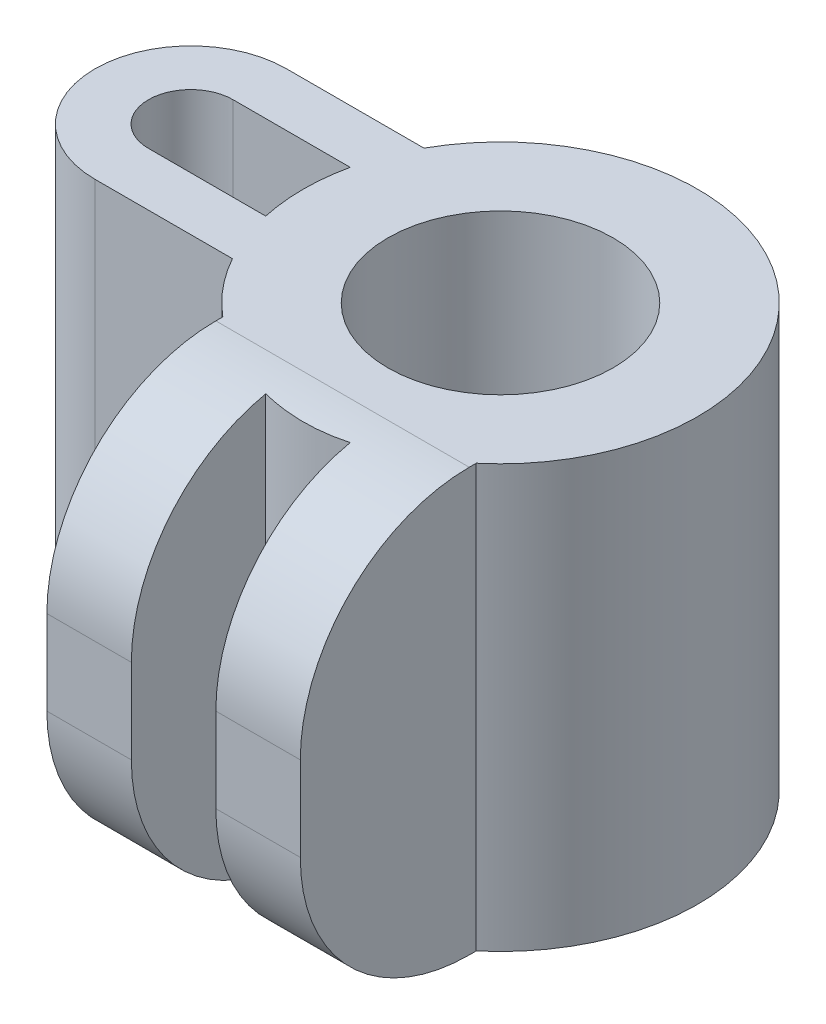
ISO-10303-21;
HEADER;
FILE_DESCRIPTION(('STEP AP214'),'2;1');
FILE_NAME('part.step','',(''),(''),'','','');
FILE_SCHEMA(('AUTOMOTIVE_DESIGN { 1 0 10303 214 1 1 1 1 }'));
ENDSEC;
DATA;
#1=APPLICATION_CONTEXT('core data for automotive mechanical design processes');
#2=APPLICATION_PROTOCOL_DEFINITION('international standard','automotive_design',2000,#1);
#3=PRODUCT_CONTEXT('',#1,'mechanical');
#4=PRODUCT('Part','Part','',(#3));
#5=PRODUCT_RELATED_PRODUCT_CATEGORY('part','',(#4));
#6=PRODUCT_DEFINITION_FORMATION('','',#4);
#7=PRODUCT_DEFINITION_CONTEXT('part definition',#1,'design');
#8=PRODUCT_DEFINITION('design','',#6,#7);
#9=PRODUCT_DEFINITION_SHAPE('','',#8);
#10=(LENGTH_UNIT() NAMED_UNIT(*) SI_UNIT(.MILLI.,.METRE.));
#11=(NAMED_UNIT(*) PLANE_ANGLE_UNIT() SI_UNIT($,.RADIAN.));
#12=(NAMED_UNIT(*) SI_UNIT($,.STERADIAN.) SOLID_ANGLE_UNIT());
#13=UNCERTAINTY_MEASURE_WITH_UNIT(LENGTH_MEASURE(1.E-05),#10,'distance_accuracy_value','');
#14=(GEOMETRIC_REPRESENTATION_CONTEXT(3) GLOBAL_UNCERTAINTY_ASSIGNED_CONTEXT((#13)) GLOBAL_UNIT_ASSIGNED_CONTEXT((#10,
#11,#12)) REPRESENTATION_CONTEXT('',''));
#15=CARTESIAN_POINT('',(0.,0.,0.));
#16=DIRECTION('',(0.,0.,1.));
#17=DIRECTION('',(1.,0.,0.));
#18=AXIS2_PLACEMENT_3D('',#15,#16,#17);
#19=CARTESIAN_POINT('',(-7.49999999999999,75.,0.));
#20=DIRECTION('',(-1.,0.,0.));
#21=DIRECTION('',(0.,0.,1.));
#22=AXIS2_PLACEMENT_3D('',#19,#20,#21);
#23=PLANE('',#22);
#24=DIRECTION('',(0.,-1.,0.));
#25=VECTOR('',#24,1.);
#26=CARTESIAN_POINT('',(-7.49999999999999,75.,34.1869858279434));
#27=LINE('',#26,#25);
#28=CARTESIAN_POINT('',(-7.49999999999999,74.3648309025873,34.1869858279434));
#29=VERTEX_POINT('',#28);
#30=CARTESIAN_POINT('',(-7.49999999999999,0.635169097412649,34.1869858279434));
#31=VERTEX_POINT('',#30);
#32=EDGE_CURVE('E216',#29,#31,#27,.T.);
#33=ORIENTED_EDGE('',*,*,#32,.F.);
#34=CARTESIAN_POINT('',(-7.49999999999999,45.,28.0464071856287));
#35=DIRECTION('',(-1.,0.,0.));
#36=DIRECTION('',(0.,0.,1.));
#37=AXIS2_PLACEMENT_3D('',#34,#35,#36);
#38=CIRCLE('',#37,30.);
#39=CARTESIAN_POINT('',(-7.49999999999999,45.,58.0464071856287));
#40=VERTEX_POINT('',#39);
#41=EDGE_CURVE('E307',#29,#40,#38,.F.);
#42=ORIENTED_EDGE('',*,*,#41,.T.);
#43=DIRECTION('',(0.,-1.,0.));
#44=VECTOR('',#43,1.);
#45=CARTESIAN_POINT('',(-7.49999999999999,75.,58.0464071856287));
#46=LINE('',#45,#44);
#47=CARTESIAN_POINT('',(-7.49999999999999,30.,58.0464071856287));
#48=VERTEX_POINT('',#47);
#49=EDGE_CURVE('E201',#40,#48,#46,.T.);
#50=ORIENTED_EDGE('',*,*,#49,.T.);
#51=CARTESIAN_POINT('',(-7.49999999999999,30.,28.0464071856287));
#52=DIRECTION('',(-1.,0.,0.));
#53=DIRECTION('',(0.,0.,1.));
#54=AXIS2_PLACEMENT_3D('',#51,#52,#53);
#55=CIRCLE('',#54,30.);
#56=EDGE_CURVE('E302',#48,#31,#55,.F.);
#57=ORIENTED_EDGE('',*,*,#56,.T.);
#58=EDGE_LOOP('',(#33,#42,#50,#57));
#59=FACE_BOUND('',#58,.T.);
#60=ADVANCED_FACE('F43',(#59),#23,.F.);
#61=CARTESIAN_POINT('',(0.,75.,0.));
#62=DIRECTION('',(0.,-1.,0.));
#63=DIRECTION('',(0.,0.,-1.));
#64=AXIS2_PLACEMENT_3D('',#61,#62,#63);
#65=CYLINDRICAL_SURFACE('',#64,35.);
#66=DIRECTION('',(0.,-1.,0.));
#67=VECTOR('',#66,1.);
#68=CARTESIAN_POINT('',(7.50000000000001,75.,34.1869858279434));
#69=LINE('',#68,#67);
#70=CARTESIAN_POINT('',(7.50000000000001,74.3648309025874,34.1869858279434));
#71=VERTEX_POINT('',#70);
#72=CARTESIAN_POINT('',(7.50000000000001,0.635169097412645,34.1869858279434));
#73=VERTEX_POINT('',#72);
#74=EDGE_CURVE('E331',#71,#73,#69,.T.);
#75=ORIENTED_EDGE('',*,*,#74,.F.);
#76=CARTESIAN_POINT('',(7.50000000000001,74.3648309025873,34.1869858279434));
#77=CARTESIAN_POINT('',(7.02538888796667,74.3430355855978,34.2911135749734));
#78=CARTESIAN_POINT('',(6.54853541709009,74.3227690143351,34.385360870876));
#79=CARTESIAN_POINT('',(5.59116738817673,74.2858285464022,34.5539429825275));
#80=CARTESIAN_POINT('',(5.11065270650957,74.2691547716139,34.6282771227643));
#81=CARTESIAN_POINT('',(4.1465735208325,74.2399292137807,34.7569069057312));
#82=CARTESIAN_POINT('',(3.66300759225003,74.227379527825,34.8111923554819));
#83=CARTESIAN_POINT('',(2.69394774237563,74.2067863399389,34.8995608958941));
#84=CARTESIAN_POINT('',(2.20845386691132,74.1987427315362,34.9336444638982));
#85=CARTESIAN_POINT('',(1.24528291865152,74.1875072954374,34.9811020556182));
#86=CARTESIAN_POINT('',(0.767624874506617,74.184229608444,34.9948426480485));
#87=CARTESIAN_POINT('',(-0.187862285972599,74.1823444089514,35.0027564203551));
#88=CARTESIAN_POINT('',(-0.665691401665883,74.1837368791319,34.9969296728013));
#89=CARTESIAN_POINT('',(-1.62040374245069,74.1911497352273,34.9657301469491));
#90=CARTESIAN_POINT('',(-2.0972873470852,74.1971675325473,34.9403683015799));
#91=CARTESIAN_POINT('',(-3.04949243955261,74.2136548216524,34.8701657017904));
#92=CARTESIAN_POINT('',(-3.52481411675227,74.2241237520856,34.8253274036157));
#93=CARTESIAN_POINT('',(-4.29219768875991,74.2444212553767,34.7370723040432));
#94=CARTESIAN_POINT('',(-4.58499608131492,74.2529705462167,34.6996386522378));
#95=CARTESIAN_POINT('',(-5.16945927732898,74.2715553386328,34.6173910061441));
#96=CARTESIAN_POINT('',(-5.46112427050666,74.2815905794159,34.572578306767));
#97=CARTESIAN_POINT('',(-6.04485111889425,74.3030981143419,34.4753219742116));
#98=CARTESIAN_POINT('',(-6.33690560851974,74.3145783417027,34.4228359342772));
#99=CARTESIAN_POINT('',(-6.91958468168665,74.3387959745473,34.3104563278657));
#100=CARTESIAN_POINT('',(-7.21020901645231,74.351533591166,34.2505615169131));
#101=CARTESIAN_POINT('',(-7.49999999999999,74.3648309025873,34.1869858279434));
#102=B_SPLINE_CURVE_WITH_KNOTS('',3,(#76,#77,#78,#79,#80,#81,#82,#83,#84,#85,#86,#87,#88,#89,
#90,#91,#92,#93,#94,#95,#96,#97,#98,#99,#100,#101),.UNSPECIFIED.,.F.,.F.,(4,2,2,2,2,2,2,2,2,2,2,
2,4),(0.,1.45906312606494,2.91817574152229,4.37802916832729,5.83784809943902,7.27102747320297,
8.704201531704,10.1365740884166,11.5687660558913,12.4545949662288,13.3402685923177,
14.2310361495164,15.1219535355566),.UNSPECIFIED.);
#103=EDGE_CURVE('E224',#71,#29,#102,.T.);
#104=ORIENTED_EDGE('',*,*,#103,.T.);
#105=ORIENTED_EDGE('',*,*,#32,.T.);
#106=CARTESIAN_POINT('',(-7.49999999999999,0.635169097412649,34.1869858279434));
#107=CARTESIAN_POINT('',(-7.02538888796665,0.656964414402143,34.2911135749734));
#108=CARTESIAN_POINT('',(-6.54853541709006,0.677230985664911,34.385360870876));
#109=CARTESIAN_POINT('',(-5.59116738817671,0.714171453597788,34.5539429825275));
#110=CARTESIAN_POINT('',(-5.11065270650955,0.730845228386054,34.6282771227643));
#111=CARTESIAN_POINT('',(-4.14657352083248,0.760070786219342,34.7569069057312));
#112=CARTESIAN_POINT('',(-3.66300759225,0.772620472174965,34.8111923554819));
#113=CARTESIAN_POINT('',(-2.69394774237561,0.793213660061105,34.8995608958941));
#114=CARTESIAN_POINT('',(-2.2084538669113,0.80125726846376,34.9336444638982));
#115=CARTESIAN_POINT('',(-1.2452829186515,0.812492704562555,34.9811020556182));
#116=CARTESIAN_POINT('',(-0.767624874506598,0.815770391556031,34.9948426480485));
#117=CARTESIAN_POINT('',(0.187862285972618,0.817655591048618,35.0027564203551));
#118=CARTESIAN_POINT('',(0.665691401665903,0.816263120868059,34.9969296728013));
#119=CARTESIAN_POINT('',(1.62040374245071,0.808850264772729,34.9657301469491));
#120=CARTESIAN_POINT('',(2.09728734708522,0.802832467452744,34.9403683015799));
#121=CARTESIAN_POINT('',(3.04949243955263,0.786345178347601,34.8701657017904));
#122=CARTESIAN_POINT('',(3.52481411675228,0.775876247914391,34.8253274036157));
#123=CARTESIAN_POINT('',(4.29219768875993,0.755578744623302,34.7370723040432));
#124=CARTESIAN_POINT('',(4.58499608131494,0.747029453783292,34.6996386522378));
#125=CARTESIAN_POINT('',(5.169459277329,0.72844466136725,34.6173910061441));
#126=CARTESIAN_POINT('',(5.46112427050668,0.718409420584057,34.5725783067671));
#127=CARTESIAN_POINT('',(6.04485111889427,0.696901885658143,34.4753219742116));
#128=CARTESIAN_POINT('',(6.33690560851976,0.685421658297267,34.4228359342772));
#129=CARTESIAN_POINT('',(6.91958468168667,0.661204025452687,34.3104563278657));
#130=CARTESIAN_POINT('',(7.21020901645233,0.648466408833965,34.2505615169131));
#131=CARTESIAN_POINT('',(7.50000000000001,0.635169097412646,34.1869858279434));
#132=B_SPLINE_CURVE_WITH_KNOTS('',3,(#106,#107,#108,#109,#110,#111,#112,#113,#114,#115,#116,
#117,#118,#119,#120,#121,#122,#123,#124,#125,#126,#127,#128,#129,#130,#131),.UNSPECIFIED.,.F.,
.F.,(4,2,2,2,2,2,2,2,2,2,2,2,4),(0.,1.45906312606494,2.9181757415223,4.37802916832729,
5.83784809943902,7.27102747320297,8.704201531704,10.1365740884166,11.5687660558913,
12.4545949662288,13.3402685923177,14.2310361495164,15.1219535355566),.UNSPECIFIED.);
#133=EDGE_CURVE('E215',#31,#73,#132,.T.);
#134=ORIENTED_EDGE('',*,*,#133,.T.);
#135=EDGE_LOOP('',(#75,#104,#105,#134));
#136=FACE_BOUND('',#135,.T.);
#137=ADVANCED_FACE('F266',(#136),#65,.T.);
#138=CARTESIAN_POINT('',(7.5,75.,0.));
#139=DIRECTION('',(-1.,0.,0.));
#140=DIRECTION('',(0.,0.,1.));
#141=AXIS2_PLACEMENT_3D('',#138,#139,#140);
#142=PLANE('',#141);
#143=ORIENTED_EDGE('',*,*,#74,.T.);
#144=CARTESIAN_POINT('',(7.50000000000001,30.,28.0464071856287));
#145=DIRECTION('',(-1.,0.,0.));
#146=DIRECTION('',(0.,0.,1.));
#147=AXIS2_PLACEMENT_3D('',#144,#145,#146);
#148=CIRCLE('',#147,30.);
#149=CARTESIAN_POINT('',(7.50000000000001,30.,58.0464071856287));
#150=VERTEX_POINT('',#149);
#151=EDGE_CURVE('E327',#73,#150,#148,.T.);
#152=ORIENTED_EDGE('',*,*,#151,.T.);
#153=DIRECTION('',(0.,-1.,0.));
#154=VECTOR('',#153,1.);
#155=CARTESIAN_POINT('',(7.50000000000001,75.,58.0464071856287));
#156=LINE('',#155,#154);
#157=CARTESIAN_POINT('',(7.50000000000001,45.,58.0464071856287));
#158=VERTEX_POINT('',#157);
#159=EDGE_CURVE('E337',#158,#150,#156,.T.);
#160=ORIENTED_EDGE('',*,*,#159,.F.);
#161=CARTESIAN_POINT('',(7.50000000000001,45.,28.0464071856287));
#162=DIRECTION('',(-1.,0.,0.));
#163=DIRECTION('',(0.,0.,1.));
#164=AXIS2_PLACEMENT_3D('',#161,#162,#163);
#165=CIRCLE('',#164,30.);
#166=EDGE_CURVE('E335',#158,#71,#165,.T.);
#167=ORIENTED_EDGE('',*,*,#166,.T.);
#168=EDGE_LOOP('',(#143,#152,#160,#167));
#169=FACE_BOUND('',#168,.T.);
#170=ADVANCED_FACE('F262',(#169),#142,.T.);
#171=CARTESIAN_POINT('',(0.,75.,58.0464071856287));
#172=DIRECTION('',(0.,0.,1.));
#173=DIRECTION('',(1.,0.,0.));
#174=AXIS2_PLACEMENT_3D('',#171,#172,#173);
#175=PLANE('',#174);
#176=ORIENTED_EDGE('',*,*,#159,.T.);
#177=DIRECTION('',(-1.,0.,0.));
#178=VECTOR('',#177,1.);
#179=CARTESIAN_POINT('',(22.5,30.,58.0464071856287));
#180=LINE('',#179,#178);
#181=CARTESIAN_POINT('',(22.5,30.,58.0464071856287));
#182=VERTEX_POINT('',#181);
#183=EDGE_CURVE('E413',#150,#182,#180,.F.);
#184=ORIENTED_EDGE('',*,*,#183,.T.);
#185=DIRECTION('',(0.,-1.,0.));
#186=VECTOR('',#185,1.);
#187=CARTESIAN_POINT('',(22.5,75.,58.0464071856287));
#188=LINE('',#187,#186);
#189=CARTESIAN_POINT('',(22.5,45.,58.0464071856287));
#190=VERTEX_POINT('',#189);
#191=EDGE_CURVE('E342',#190,#182,#188,.T.);
#192=ORIENTED_EDGE('',*,*,#191,.F.);
#193=DIRECTION('',(-1.,0.,0.));
#194=VECTOR('',#193,1.);
#195=CARTESIAN_POINT('',(0.,45.,58.0464071856287));
#196=LINE('',#195,#194);
#197=EDGE_CURVE('E663',#190,#158,#196,.T.);
#198=ORIENTED_EDGE('',*,*,#197,.T.);
#199=EDGE_LOOP('',(#176,#184,#192,#198));
#200=FACE_BOUND('',#199,.T.);
#201=ADVANCED_FACE('F258',(#200),#175,.T.);
#202=CARTESIAN_POINT('',(22.5,75.,0.));
#203=DIRECTION('',(-1.,0.,0.));
#204=DIRECTION('',(0.,0.,1.));
#205=AXIS2_PLACEMENT_3D('',#202,#203,#204);
#206=PLANE('',#205);
#207=ORIENTED_EDGE('',*,*,#191,.T.);
#208=CARTESIAN_POINT('',(22.5,30.,28.0464071856287));
#209=DIRECTION('',(-1.,0.,0.));
#210=DIRECTION('',(0.,0.,1.));
#211=AXIS2_PLACEMENT_3D('',#208,#209,#210);
#212=CIRCLE('',#211,30.);
#213=CARTESIAN_POINT('',(22.5,0.,28.0464071856287));
#214=VERTEX_POINT('',#213);
#215=EDGE_CURVE('E303',#182,#214,#212,.F.);
#216=ORIENTED_EDGE('',*,*,#215,.T.);
#217=DIRECTION('',(0.,0.,-1.));
#218=VECTOR('',#217,1.);
#219=CARTESIAN_POINT('',(22.5,0.,0.));
#220=LINE('',#219,#218);
#221=CARTESIAN_POINT('',(22.5,0.,26.809513236909));
#222=VERTEX_POINT('',#221);
#223=EDGE_CURVE('E363',#214,#222,#220,.T.);
#224=ORIENTED_EDGE('',*,*,#223,.T.);
#225=DIRECTION('',(0.,-1.,0.));
#226=VECTOR('',#225,1.);
#227=CARTESIAN_POINT('',(22.5,75.,26.809513236909));
#228=LINE('',#227,#226);
#229=CARTESIAN_POINT('',(22.5,75.,26.809513236909));
#230=VERTEX_POINT('',#229);
#231=EDGE_CURVE('E404',#230,#222,#228,.T.);
#232=ORIENTED_EDGE('',*,*,#231,.F.);
#233=DIRECTION('',(0.,0.,-1.));
#234=VECTOR('',#233,1.);
#235=CARTESIAN_POINT('',(22.5,75.,0.));
#236=LINE('',#235,#234);
#237=CARTESIAN_POINT('',(22.5,75.,28.0464071856287));
#238=VERTEX_POINT('',#237);
#239=EDGE_CURVE('E446',#238,#230,#236,.T.);
#240=ORIENTED_EDGE('',*,*,#239,.F.);
#241=CARTESIAN_POINT('',(22.5,45.,28.0464071856287));
#242=DIRECTION('',(-1.,0.,0.));
#243=DIRECTION('',(0.,0.,1.));
#244=AXIS2_PLACEMENT_3D('',#241,#242,#243);
#245=CIRCLE('',#244,30.);
#246=EDGE_CURVE('E299',#238,#190,#245,.F.);
#247=ORIENTED_EDGE('',*,*,#246,.T.);
#248=EDGE_LOOP('',(#207,#216,#224,#232,#240,#247));
#249=FACE_BOUND('',#248,.T.);
#250=ADVANCED_FACE('F255',(#249),#206,.F.);
#251=CARTESIAN_POINT('',(0.,0.,0.));
#252=DIRECTION('',(0.,1.,0.));
#253=DIRECTION('',(0.,0.,1.));
#254=AXIS2_PLACEMENT_3D('',#251,#252,#253);
#255=CIRCLE('',#254,35.);
#256=CARTESIAN_POINT('',(-30.5941170815567,0.,-17.));
#257=VERTEX_POINT('',#256);
#258=EDGE_CURVE('E366',#222,#257,#255,.T.);
#259=ORIENTED_EDGE('',*,*,#258,.T.);
#260=DIRECTION('',(0.,-1.,0.));
#261=VECTOR('',#260,1.);
#262=CARTESIAN_POINT('',(-30.5941170815567,75.,-17.));
#263=LINE('',#262,#261);
#264=CARTESIAN_POINT('',(-30.5941170815567,75.,-17.));
#265=VERTEX_POINT('',#264);
#266=EDGE_CURVE('E401',#265,#257,#263,.T.);
#267=ORIENTED_EDGE('',*,*,#266,.F.);
#268=CARTESIAN_POINT('',(0.,75.,0.));
#269=DIRECTION('',(0.,1.,0.));
#270=DIRECTION('',(0.,0.,1.));
#271=AXIS2_PLACEMENT_3D('',#268,#269,#270);
#272=CIRCLE('',#271,35.);
#273=EDGE_CURVE('E186',#230,#265,#272,.T.);
#274=ORIENTED_EDGE('',*,*,#273,.F.);
#275=ORIENTED_EDGE('',*,*,#231,.T.);
#276=EDGE_LOOP('',(#259,#267,#274,#275));
#277=FACE_BOUND('',#276,.T.);
#278=ADVANCED_FACE('F241',(#277),#65,.T.);
#279=CARTESIAN_POINT('',(0.,75.,-17.));
#280=DIRECTION('',(0.,0.,-1.));
#281=DIRECTION('',(-1.,0.,0.));
#282=AXIS2_PLACEMENT_3D('',#279,#280,#281);
#283=PLANE('',#282);
#284=DIRECTION('',(1.,0.,0.));
#285=VECTOR('',#284,1.);
#286=CARTESIAN_POINT('',(0.,0.,-17.));
#287=LINE('',#286,#285);
#288=CARTESIAN_POINT('',(-55.,0.,-17.));
#289=VERTEX_POINT('',#288);
#290=EDGE_CURVE('E370',#289,#257,#287,.T.);
#291=ORIENTED_EDGE('',*,*,#290,.F.);
#292=DIRECTION('',(0.,-1.,0.));
#293=VECTOR('',#292,1.);
#294=CARTESIAN_POINT('',(-55.,75.,-17.));
#295=LINE('',#294,#293);
#296=CARTESIAN_POINT('',(-55.,75.,-17.));
#297=VERTEX_POINT('',#296);
#298=EDGE_CURVE('E398',#297,#289,#295,.T.);
#299=ORIENTED_EDGE('',*,*,#298,.F.);
#300=DIRECTION('',(1.,0.,0.));
#301=VECTOR('',#300,1.);
#302=CARTESIAN_POINT('',(0.,75.,-17.));
#303=LINE('',#302,#301);
#304=EDGE_CURVE('E442',#297,#265,#303,.T.);
#305=ORIENTED_EDGE('',*,*,#304,.T.);
#306=ORIENTED_EDGE('',*,*,#266,.T.);
#307=EDGE_LOOP('',(#291,#299,#305,#306));
#308=FACE_BOUND('',#307,.T.);
#309=ADVANCED_FACE('F250',(#308),#283,.T.);
#310=CARTESIAN_POINT('',(-55.,75.,0.));
#311=DIRECTION('',(0.,-1.,0.));
#312=DIRECTION('',(0.,0.,-1.));
#313=AXIS2_PLACEMENT_3D('',#310,#311,#312);
#314=CYLINDRICAL_SURFACE('',#313,17.);
#315=CARTESIAN_POINT('',(-55.,0.,0.));
#316=DIRECTION('',(0.,1.,0.));
#317=DIRECTION('',(0.,0.,1.));
#318=AXIS2_PLACEMENT_3D('',#315,#316,#317);
#319=CIRCLE('',#318,17.);
#320=CARTESIAN_POINT('',(-55.,0.,17.));
#321=VERTEX_POINT('',#320);
#322=EDGE_CURVE('E374',#289,#321,#319,.T.);
#323=ORIENTED_EDGE('',*,*,#322,.T.);
#324=DIRECTION('',(0.,-1.,0.));
#325=VECTOR('',#324,1.);
#326=CARTESIAN_POINT('',(-55.,75.,17.));
#327=LINE('',#326,#325);
#328=CARTESIAN_POINT('',(-55.,75.,17.));
#329=VERTEX_POINT('',#328);
#330=EDGE_CURVE('E394',#329,#321,#327,.T.);
#331=ORIENTED_EDGE('',*,*,#330,.F.);
#332=CARTESIAN_POINT('',(-55.,75.,0.));
#333=DIRECTION('',(0.,1.,0.));
#334=DIRECTION('',(0.,0.,1.));
#335=AXIS2_PLACEMENT_3D('',#332,#333,#334);
#336=CIRCLE('',#335,17.);
#337=EDGE_CURVE('E439',#297,#329,#336,.T.);
#338=ORIENTED_EDGE('',*,*,#337,.F.);
#339=ORIENTED_EDGE('',*,*,#298,.T.);
#340=EDGE_LOOP('',(#323,#331,#338,#339));
#341=FACE_BOUND('',#340,.T.);
#342=ADVANCED_FACE('F246',(#341),#314,.T.);
#343=CARTESIAN_POINT('',(0.,75.,17.));
#344=DIRECTION('',(0.,0.,-1.));
#345=DIRECTION('',(-1.,0.,0.));
#346=AXIS2_PLACEMENT_3D('',#343,#344,#345);
#347=PLANE('',#346);
#348=DIRECTION('',(1.,0.,0.));
#349=VECTOR('',#348,1.);
#350=CARTESIAN_POINT('',(0.,0.,17.));
#351=LINE('',#350,#349);
#352=CARTESIAN_POINT('',(-30.5941170815567,0.,17.));
#353=VERTEX_POINT('',#352);
#354=EDGE_CURVE('E377',#321,#353,#351,.T.);
#355=ORIENTED_EDGE('',*,*,#354,.T.);
#356=DIRECTION('',(0.,-1.,0.));
#357=VECTOR('',#356,1.);
#358=CARTESIAN_POINT('',(-30.5941170815567,75.,17.));
#359=LINE('',#358,#357);
#360=CARTESIAN_POINT('',(-30.5941170815567,75.,17.));
#361=VERTEX_POINT('',#360);
#362=EDGE_CURVE('E390',#361,#353,#359,.T.);
#363=ORIENTED_EDGE('',*,*,#362,.F.);
#364=DIRECTION('',(1.,0.,0.));
#365=VECTOR('',#364,1.);
#366=CARTESIAN_POINT('',(0.,75.,17.));
#367=LINE('',#366,#365);
#368=EDGE_CURVE('E436',#329,#361,#367,.T.);
#369=ORIENTED_EDGE('',*,*,#368,.F.);
#370=ORIENTED_EDGE('',*,*,#330,.T.);
#371=EDGE_LOOP('',(#355,#363,#369,#370));
#372=FACE_BOUND('',#371,.T.);
#373=ADVANCED_FACE('F239',(#372),#347,.F.);
#374=CARTESIAN_POINT('',(-22.5,0.,26.809513236909));
#375=VERTEX_POINT('',#374);
#376=EDGE_CURVE('E380',#353,#375,#255,.T.);
#377=ORIENTED_EDGE('',*,*,#376,.T.);
#378=DIRECTION('',(0.,-1.,0.));
#379=VECTOR('',#378,1.);
#380=CARTESIAN_POINT('',(-22.5,75.,26.809513236909));
#381=LINE('',#380,#379);
#382=CARTESIAN_POINT('',(-22.5,75.,26.809513236909));
#383=VERTEX_POINT('',#382);
#384=EDGE_CURVE('E291',#383,#375,#381,.T.);
#385=ORIENTED_EDGE('',*,*,#384,.F.);
#386=EDGE_CURVE('E185',#361,#383,#272,.T.);
#387=ORIENTED_EDGE('',*,*,#386,.F.);
#388=ORIENTED_EDGE('',*,*,#362,.T.);
#389=EDGE_LOOP('',(#377,#385,#387,#388));
#390=FACE_BOUND('',#389,.T.);
#391=ADVANCED_FACE('F233',(#390),#65,.T.);
#392=CARTESIAN_POINT('',(-22.5,75.,0.));
#393=DIRECTION('',(-1.,0.,0.));
#394=DIRECTION('',(0.,0.,1.));
#395=AXIS2_PLACEMENT_3D('',#392,#393,#394);
#396=PLANE('',#395);
#397=DIRECTION('',(0.,-1.,0.));
#398=VECTOR('',#397,1.);
#399=CARTESIAN_POINT('',(-22.5,75.,58.0464071856287));
#400=LINE('',#399,#398);
#401=CARTESIAN_POINT('',(-22.5,45.,58.0464071856287));
#402=VERTEX_POINT('',#401);
#403=CARTESIAN_POINT('',(-22.5,30.,58.0464071856287));
#404=VERTEX_POINT('',#403);
#405=EDGE_CURVE('E206',#402,#404,#400,.T.);
#406=ORIENTED_EDGE('',*,*,#405,.F.);
#407=CARTESIAN_POINT('',(-22.5,45.,28.0464071856287));
#408=DIRECTION('',(-1.,0.,0.));
#409=DIRECTION('',(0.,0.,1.));
#410=AXIS2_PLACEMENT_3D('',#407,#408,#409);
#411=CIRCLE('',#410,30.);
#412=CARTESIAN_POINT('',(-22.5,75.,28.0464071856287));
#413=VERTEX_POINT('',#412);
#414=EDGE_CURVE('E11',#402,#413,#411,.T.);
#415=ORIENTED_EDGE('',*,*,#414,.T.);
#416=DIRECTION('',(0.,0.,-1.));
#417=VECTOR('',#416,1.);
#418=CARTESIAN_POINT('',(-22.5,75.,0.));
#419=LINE('',#418,#417);
#420=EDGE_CURVE('E419',#413,#383,#419,.T.);
#421=ORIENTED_EDGE('',*,*,#420,.T.);
#422=ORIENTED_EDGE('',*,*,#384,.T.);
#423=DIRECTION('',(0.,0.,-1.));
#424=VECTOR('',#423,1.);
#425=CARTESIAN_POINT('',(-22.5,0.,0.));
#426=LINE('',#425,#424);
#427=CARTESIAN_POINT('',(-22.5,0.,28.0464071856287));
#428=VERTEX_POINT('',#427);
#429=EDGE_CURVE('E381',#428,#375,#426,.T.);
#430=ORIENTED_EDGE('',*,*,#429,.F.);
#431=CARTESIAN_POINT('',(-22.5,30.,28.0464071856287));
#432=DIRECTION('',(-1.,0.,0.));
#433=DIRECTION('',(0.,0.,1.));
#434=AXIS2_PLACEMENT_3D('',#431,#432,#433);
#435=CIRCLE('',#434,30.);
#436=EDGE_CURVE('E53',#428,#404,#435,.T.);
#437=ORIENTED_EDGE('',*,*,#436,.T.);
#438=EDGE_LOOP('',(#406,#415,#421,#422,#430,#437));
#439=FACE_BOUND('',#438,.T.);
#440=ADVANCED_FACE('F238',(#439),#396,.T.);
#441=CARTESIAN_POINT('',(0.,75.,-7.5));
#442=DIRECTION('',(0.,0.,-1.));
#443=DIRECTION('',(-1.,0.,0.));
#444=AXIS2_PLACEMENT_3D('',#441,#442,#443);
#445=PLANE('',#444);
#446=DIRECTION('',(1.,0.,0.));
#447=VECTOR('',#446,1.);
#448=CARTESIAN_POINT('',(0.,0.,-7.5));
#449=LINE('',#448,#447);
#450=CARTESIAN_POINT('',(-55.,0.,-7.5));
#451=VERTEX_POINT('',#450);
#452=CARTESIAN_POINT('',(-34.1869858279434,0.,-7.5));
#453=VERTEX_POINT('',#452);
#454=EDGE_CURVE('E199',#451,#453,#449,.T.);
#455=ORIENTED_EDGE('',*,*,#454,.T.);
#456=DIRECTION('',(0.,-1.,0.));
#457=VECTOR('',#456,1.);
#458=CARTESIAN_POINT('',(-34.1869858279434,75.,-7.5));
#459=LINE('',#458,#457);
#460=CARTESIAN_POINT('',(-34.1869858279434,75.,-7.5));
#461=VERTEX_POINT('',#460);
#462=EDGE_CURVE('E175',#461,#453,#459,.T.);
#463=ORIENTED_EDGE('',*,*,#462,.F.);
#464=DIRECTION('',(1.,0.,0.));
#465=VECTOR('',#464,1.);
#466=CARTESIAN_POINT('',(0.,75.,-7.5));
#467=LINE('',#466,#465);
#468=CARTESIAN_POINT('',(-55.,75.,-7.5));
#469=VERTEX_POINT('',#468);
#470=EDGE_CURVE('E183',#469,#461,#467,.T.);
#471=ORIENTED_EDGE('',*,*,#470,.F.);
#472=DIRECTION('',(0.,-1.,0.));
#473=VECTOR('',#472,1.);
#474=CARTESIAN_POINT('',(-55.,75.,-7.5));
#475=LINE('',#474,#473);
#476=EDGE_CURVE('E346',#469,#451,#475,.T.);
#477=ORIENTED_EDGE('',*,*,#476,.T.);
#478=EDGE_LOOP('',(#455,#463,#471,#477));
#479=FACE_BOUND('',#478,.T.);
#480=ADVANCED_FACE('F197',(#479),#445,.F.);
#481=CARTESIAN_POINT('',(-34.1869858279434,0.,7.5));
#482=VERTEX_POINT('',#481);
#483=EDGE_CURVE('E358',#453,#482,#255,.T.);
#484=ORIENTED_EDGE('',*,*,#483,.T.);
#485=DIRECTION('',(0.,-1.,0.));
#486=VECTOR('',#485,1.);
#487=CARTESIAN_POINT('',(-34.1869858279434,75.,7.5));
#488=LINE('',#487,#486);
#489=CARTESIAN_POINT('',(-34.1869858279434,75.,7.5));
#490=VERTEX_POINT('',#489);
#491=EDGE_CURVE('E177',#490,#482,#488,.T.);
#492=ORIENTED_EDGE('',*,*,#491,.F.);
#493=EDGE_CURVE('E170',#461,#490,#272,.T.);
#494=ORIENTED_EDGE('',*,*,#493,.F.);
#495=ORIENTED_EDGE('',*,*,#462,.T.);
#496=EDGE_LOOP('',(#484,#492,#494,#495));
#497=FACE_BOUND('',#496,.T.);
#498=ADVANCED_FACE('F173',(#497),#65,.T.);
#499=CARTESIAN_POINT('',(0.,75.,7.5));
#500=DIRECTION('',(0.,0.,-1.));
#501=DIRECTION('',(-1.,0.,0.));
#502=AXIS2_PLACEMENT_3D('',#499,#500,#501);
#503=PLANE('',#502);
#504=DIRECTION('',(1.,0.,0.));
#505=VECTOR('',#504,1.);
#506=CARTESIAN_POINT('',(0.,0.,7.5));
#507=LINE('',#506,#505);
#508=CARTESIAN_POINT('',(-55.,0.,7.5));
#509=VERTEX_POINT('',#508);
#510=EDGE_CURVE('E355',#509,#482,#507,.T.);
#511=ORIENTED_EDGE('',*,*,#510,.F.);
#512=DIRECTION('',(0.,-1.,0.));
#513=VECTOR('',#512,1.);
#514=CARTESIAN_POINT('',(-55.,75.,7.5));
#515=LINE('',#514,#513);
#516=CARTESIAN_POINT('',(-55.,75.,7.5));
#517=VERTEX_POINT('',#516);
#518=EDGE_CURVE('E208',#517,#509,#515,.T.);
#519=ORIENTED_EDGE('',*,*,#518,.F.);
#520=DIRECTION('',(1.,0.,0.));
#521=VECTOR('',#520,1.);
#522=CARTESIAN_POINT('',(0.,75.,7.5));
#523=LINE('',#522,#521);
#524=EDGE_CURVE('E182',#517,#490,#523,.T.);
#525=ORIENTED_EDGE('',*,*,#524,.T.);
#526=ORIENTED_EDGE('',*,*,#491,.T.);
#527=EDGE_LOOP('',(#511,#519,#525,#526));
#528=FACE_BOUND('',#527,.T.);
#529=ADVANCED_FACE('F277',(#528),#503,.T.);
#530=CARTESIAN_POINT('',(0.,75.,58.0464071856287));
#531=DIRECTION('',(0.,0.,-1.));
#532=DIRECTION('',(-1.,0.,0.));
#533=AXIS2_PLACEMENT_3D('',#530,#531,#532);
#534=PLANE('',#533);
#535=ORIENTED_EDGE('',*,*,#49,.F.);
#536=DIRECTION('',(1.,0.,0.));
#537=VECTOR('',#536,1.);
#538=CARTESIAN_POINT('',(-22.5,45.,58.0464071856287));
#539=LINE('',#538,#537);
#540=EDGE_CURVE('E66',#40,#402,#539,.F.);
#541=ORIENTED_EDGE('',*,*,#540,.T.);
#542=ORIENTED_EDGE('',*,*,#405,.T.);
#543=DIRECTION('',(1.,0.,0.));
#544=VECTOR('',#543,1.);
#545=CARTESIAN_POINT('',(0.,30.,58.0464071856287));
#546=LINE('',#545,#544);
#547=EDGE_CURVE('E315',#404,#48,#546,.T.);
#548=ORIENTED_EDGE('',*,*,#547,.T.);
#549=EDGE_LOOP('',(#535,#541,#542,#548));
#550=FACE_BOUND('',#549,.T.);
#551=ADVANCED_FACE('F275',(#550),#534,.F.);
#552=CARTESIAN_POINT('',(-55.,75.,0.));
#553=DIRECTION('',(0.,-1.,0.));
#554=DIRECTION('',(0.,0.,-1.));
#555=AXIS2_PLACEMENT_3D('',#552,#553,#554);
#556=CYLINDRICAL_SURFACE('',#555,7.5);
#557=CARTESIAN_POINT('',(-55.,0.,0.));
#558=DIRECTION('',(0.,1.,0.));
#559=DIRECTION('',(0.,0.,1.));
#560=AXIS2_PLACEMENT_3D('',#557,#558,#559);
#561=CIRCLE('',#560,7.5);
#562=EDGE_CURVE('E353',#451,#509,#561,.T.);
#563=ORIENTED_EDGE('',*,*,#562,.F.);
#564=ORIENTED_EDGE('',*,*,#476,.F.);
#565=CARTESIAN_POINT('',(-55.,75.,0.));
#566=DIRECTION('',(0.,1.,0.));
#567=DIRECTION('',(0.,0.,1.));
#568=AXIS2_PLACEMENT_3D('',#565,#566,#567);
#569=CIRCLE('',#568,7.5);
#570=EDGE_CURVE('E192',#469,#517,#569,.T.);
#571=ORIENTED_EDGE('',*,*,#570,.T.);
#572=ORIENTED_EDGE('',*,*,#518,.T.);
#573=EDGE_LOOP('',(#563,#564,#571,#572));
#574=FACE_BOUND('',#573,.T.);
#575=ADVANCED_FACE('F271',(#574),#556,.F.);
#576=CARTESIAN_POINT('',(0.,75.,0.));
#577=DIRECTION('',(0.,-1.,0.));
#578=DIRECTION('',(0.,0.,-1.));
#579=AXIS2_PLACEMENT_3D('',#576,#577,#578);
#580=CYLINDRICAL_SURFACE('',#579,20.);
#581=CARTESIAN_POINT('',(0.,75.,0.));
#582=DIRECTION('',(0.,1.,0.));
#583=DIRECTION('',(0.,0.,1.));
#584=AXIS2_PLACEMENT_3D('',#581,#582,#583);
#585=CIRCLE('',#584,20.);
#586=CARTESIAN_POINT('',(0.,75.,20.));
#587=VERTEX_POINT('',#586);
#588=EDGE_CURVE('E348',#587,#587,#585,.T.);
#589=ORIENTED_EDGE('',*,*,#588,.T.);
#590=EDGE_LOOP('',(#589));
#591=FACE_BOUND('',#590,.T.);
#592=CARTESIAN_POINT('',(0.,0.,0.));
#593=DIRECTION('',(0.,1.,0.));
#594=DIRECTION('',(0.,0.,1.));
#595=AXIS2_PLACEMENT_3D('',#592,#593,#594);
#596=CIRCLE('',#595,20.);
#597=CARTESIAN_POINT('',(0.,0.,20.));
#598=VERTEX_POINT('',#597);
#599=EDGE_CURVE('E195',#598,#598,#596,.T.);
#600=ORIENTED_EDGE('',*,*,#599,.F.);
#601=EDGE_LOOP('',(#600));
#602=FACE_BOUND('',#601,.T.);
#603=ADVANCED_FACE('F274',(#591,#602),#580,.F.);
#604=CARTESIAN_POINT('',(0.,75.,0.));
#605=DIRECTION('',(0.,1.,0.));
#606=DIRECTION('',(0.,0.,1.));
#607=AXIS2_PLACEMENT_3D('',#604,#605,#606);
#608=PLANE('',#607);
#609=ORIENTED_EDGE('',*,*,#470,.T.);
#610=ORIENTED_EDGE('',*,*,#493,.T.);
#611=ORIENTED_EDGE('',*,*,#524,.F.);
#612=ORIENTED_EDGE('',*,*,#570,.F.);
#613=EDGE_LOOP('',(#609,#610,#611,#612));
#614=FACE_BOUND('',#613,.T.);
#615=DIRECTION('',(1.,0.,0.));
#616=VECTOR('',#615,1.);
#617=CARTESIAN_POINT('',(-7.49999999999999,75.,28.0464071856287));
#618=LINE('',#617,#616);
#619=EDGE_CURVE('E297',#413,#238,#618,.T.);
#620=ORIENTED_EDGE('',*,*,#619,.T.);
#621=ORIENTED_EDGE('',*,*,#239,.T.);
#622=ORIENTED_EDGE('',*,*,#273,.T.);
#623=ORIENTED_EDGE('',*,*,#304,.F.);
#624=ORIENTED_EDGE('',*,*,#337,.T.);
#625=ORIENTED_EDGE('',*,*,#368,.T.);
#626=ORIENTED_EDGE('',*,*,#386,.T.);
#627=ORIENTED_EDGE('',*,*,#420,.F.);
#628=EDGE_LOOP('',(#620,#621,#622,#623,#624,#625,#626,#627));
#629=FACE_BOUND('',#628,.T.);
#630=ORIENTED_EDGE('',*,*,#588,.F.);
#631=EDGE_LOOP('',(#630));
#632=FACE_BOUND('',#631,.T.);
#633=ADVANCED_FACE('F189',(#614,#629,#632),#608,.T.);
#634=CARTESIAN_POINT('',(0.,0.,0.));
#635=DIRECTION('',(0.,1.,0.));
#636=DIRECTION('',(0.,0.,1.));
#637=AXIS2_PLACEMENT_3D('',#634,#635,#636);
#638=PLANE('',#637);
#639=ORIENTED_EDGE('',*,*,#454,.F.);
#640=ORIENTED_EDGE('',*,*,#562,.T.);
#641=ORIENTED_EDGE('',*,*,#510,.T.);
#642=ORIENTED_EDGE('',*,*,#483,.F.);
#643=EDGE_LOOP('',(#639,#640,#641,#642));
#644=FACE_BOUND('',#643,.T.);
#645=ORIENTED_EDGE('',*,*,#223,.F.);
#646=DIRECTION('',(1.,0.,0.));
#647=VECTOR('',#646,1.);
#648=CARTESIAN_POINT('',(0.,0.,28.0464071856287));
#649=LINE('',#648,#647);
#650=EDGE_CURVE('E212',#214,#428,#649,.F.);
#651=ORIENTED_EDGE('',*,*,#650,.T.);
#652=ORIENTED_EDGE('',*,*,#429,.T.);
#653=ORIENTED_EDGE('',*,*,#376,.F.);
#654=ORIENTED_EDGE('',*,*,#354,.F.);
#655=ORIENTED_EDGE('',*,*,#322,.F.);
#656=ORIENTED_EDGE('',*,*,#290,.T.);
#657=ORIENTED_EDGE('',*,*,#258,.F.);
#658=EDGE_LOOP('',(#645,#651,#652,#653,#654,#655,#656,#657));
#659=FACE_BOUND('',#658,.T.);
#660=ORIENTED_EDGE('',*,*,#599,.T.);
#661=EDGE_LOOP('',(#660));
#662=FACE_BOUND('',#661,.T.);
#663=ADVANCED_FACE('F360',(#644,#659,#662),#638,.F.);
#664=CARTESIAN_POINT('',(0.,30.,28.0464071856287));
#665=DIRECTION('',(1.,0.,0.));
#666=DIRECTION('',(0.,0.,-1.));
#667=AXIS2_PLACEMENT_3D('',#664,#665,#666);
#668=CYLINDRICAL_SURFACE('',#667,30.);
#669=ORIENTED_EDGE('',*,*,#436,.F.);
#670=ORIENTED_EDGE('',*,*,#650,.F.);
#671=ORIENTED_EDGE('',*,*,#215,.F.);
#672=ORIENTED_EDGE('',*,*,#183,.F.);
#673=ORIENTED_EDGE('',*,*,#151,.F.);
#674=ORIENTED_EDGE('',*,*,#133,.F.);
#675=ORIENTED_EDGE('',*,*,#56,.F.);
#676=ORIENTED_EDGE('',*,*,#547,.F.);
#677=EDGE_LOOP('',(#669,#670,#671,#672,#673,#674,#675,#676));
#678=FACE_BOUND('',#677,.T.);
#679=ADVANCED_FACE('F230',(#678),#668,.T.);
#680=CARTESIAN_POINT('',(0.,45.,28.0464071856287));
#681=DIRECTION('',(-1.,0.,0.));
#682=DIRECTION('',(0.,0.,1.));
#683=AXIS2_PLACEMENT_3D('',#680,#681,#682);
#684=CYLINDRICAL_SURFACE('',#683,30.);
#685=ORIENTED_EDGE('',*,*,#41,.F.);
#686=ORIENTED_EDGE('',*,*,#103,.F.);
#687=ORIENTED_EDGE('',*,*,#166,.F.);
#688=ORIENTED_EDGE('',*,*,#197,.F.);
#689=ORIENTED_EDGE('',*,*,#246,.F.);
#690=ORIENTED_EDGE('',*,*,#619,.F.);
#691=ORIENTED_EDGE('',*,*,#414,.F.);
#692=ORIENTED_EDGE('',*,*,#540,.F.);
#693=EDGE_LOOP('',(#685,#686,#687,#688,#689,#690,#691,#692));
#694=FACE_BOUND('',#693,.T.);
#695=ADVANCED_FACE('F45',(#694),#684,.T.);
#696=CLOSED_SHELL('',(#60,#137,#170,#201,#250,#278,#309,#342,#373,#391,#440,#480,#498,#529,#551,
#575,#603,#633,#663,#679,#695));
#697=MANIFOLD_SOLID_BREP('B2',#696);
#698=ADVANCED_BREP_SHAPE_REPRESENTATION('',(#18,#697),#14);
#699=SHAPE_DEFINITION_REPRESENTATION(#9,#698);
ENDSEC;
END-ISO-10303-21;
